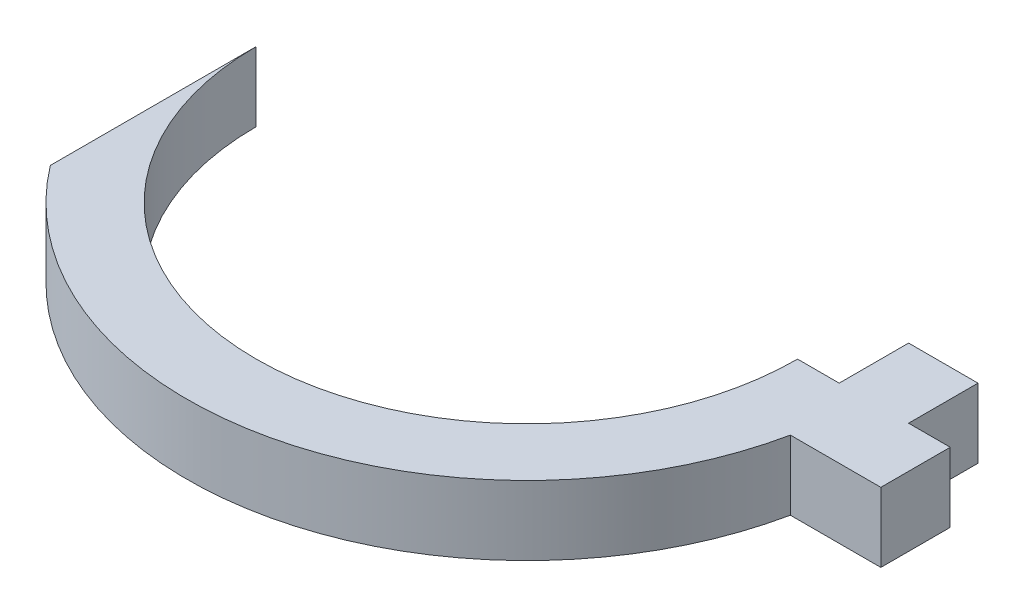
ISO-10303-21;
HEADER;
FILE_DESCRIPTION(('STEP AP214'),'2;1');
FILE_NAME('part.step','',(''),(''),'','','');
FILE_SCHEMA(('AUTOMOTIVE_DESIGN { 1 0 10303 214 1 1 1 1 }'));
ENDSEC;
DATA;
#1=APPLICATION_CONTEXT('core data for automotive mechanical design processes');
#2=APPLICATION_PROTOCOL_DEFINITION('international standard','automotive_design',2000,#1);
#3=PRODUCT_CONTEXT('',#1,'mechanical');
#4=PRODUCT('Part','Part','',(#3));
#5=PRODUCT_RELATED_PRODUCT_CATEGORY('part','',(#4));
#6=PRODUCT_DEFINITION_FORMATION('','',#4);
#7=PRODUCT_DEFINITION_CONTEXT('part definition',#1,'design');
#8=PRODUCT_DEFINITION('design','',#6,#7);
#9=PRODUCT_DEFINITION_SHAPE('','',#8);
#10=(LENGTH_UNIT() NAMED_UNIT(*) SI_UNIT(.MILLI.,.METRE.));
#11=(NAMED_UNIT(*) PLANE_ANGLE_UNIT() SI_UNIT($,.RADIAN.));
#12=(NAMED_UNIT(*) SI_UNIT($,.STERADIAN.) SOLID_ANGLE_UNIT());
#13=UNCERTAINTY_MEASURE_WITH_UNIT(LENGTH_MEASURE(1.E-05),#10,'distance_accuracy_value','');
#14=(GEOMETRIC_REPRESENTATION_CONTEXT(3) GLOBAL_UNCERTAINTY_ASSIGNED_CONTEXT((#13)) GLOBAL_UNIT_ASSIGNED_CONTEXT((#10,
#11,#12)) REPRESENTATION_CONTEXT('',''));
#15=CARTESIAN_POINT('',(0.,0.,0.));
#16=DIRECTION('',(0.,0.,1.));
#17=DIRECTION('',(1.,0.,0.));
#18=AXIS2_PLACEMENT_3D('',#15,#16,#17);
#19=CARTESIAN_POINT('',(0.,6.35,0.));
#20=DIRECTION('',(-1.,0.,0.));
#21=DIRECTION('',(0.,0.,1.));
#22=AXIS2_PLACEMENT_3D('',#19,#20,#21);
#23=PLANE('',#22);
#24=DIRECTION('',(0.,0.,-1.));
#25=VECTOR('',#24,1.);
#26=CARTESIAN_POINT('',(0.,0.,0.));
#27=LINE('',#26,#25);
#28=CARTESIAN_POINT('',(0.,0.,6.35));
#29=VERTEX_POINT('',#28);
#30=CARTESIAN_POINT('',(0.,0.,0.));
#31=VERTEX_POINT('',#30);
#32=EDGE_CURVE('E141',#29,#31,#27,.T.);
#33=ORIENTED_EDGE('',*,*,#32,.T.);
#34=DIRECTION('',(0.,-1.,0.));
#35=VECTOR('',#34,1.);
#36=CARTESIAN_POINT('',(0.,6.35,0.));
#37=LINE('',#36,#35);
#38=CARTESIAN_POINT('',(0.,6.35,0.));
#39=VERTEX_POINT('',#38);
#40=EDGE_CURVE('E11',#39,#31,#37,.T.);
#41=ORIENTED_EDGE('',*,*,#40,.F.);
#42=DIRECTION('',(0.,0.,-1.));
#43=VECTOR('',#42,1.);
#44=CARTESIAN_POINT('',(0.,6.35,0.));
#45=LINE('',#44,#43);
#46=CARTESIAN_POINT('',(0.,6.35,6.35));
#47=VERTEX_POINT('',#46);
#48=EDGE_CURVE('E159',#47,#39,#45,.T.);
#49=ORIENTED_EDGE('',*,*,#48,.F.);
#50=DIRECTION('',(0.,-1.,0.));
#51=VECTOR('',#50,1.);
#52=CARTESIAN_POINT('',(0.,6.35,6.35));
#53=LINE('',#52,#51);
#54=EDGE_CURVE('E137',#47,#29,#53,.T.);
#55=ORIENTED_EDGE('',*,*,#54,.T.);
#56=EDGE_LOOP('',(#33,#41,#49,#55));
#57=FACE_BOUND('',#56,.T.);
#58=ADVANCED_FACE('F33',(#57),#23,.F.);
#59=CARTESIAN_POINT('',(-6.34999999999999,6.35,0.));
#60=DIRECTION('',(0.,0.,1.));
#61=DIRECTION('',(1.,0.,0.));
#62=AXIS2_PLACEMENT_3D('',#59,#60,#61);
#63=PLANE('',#62);
#64=DIRECTION('',(-1.,0.,0.));
#65=VECTOR('',#64,1.);
#66=CARTESIAN_POINT('',(-6.34999999999999,0.,0.));
#67=LINE('',#66,#65);
#68=CARTESIAN_POINT('',(-6.34999999999999,0.,0.));
#69=VERTEX_POINT('',#68);
#70=EDGE_CURVE('E144',#31,#69,#67,.T.);
#71=ORIENTED_EDGE('',*,*,#70,.T.);
#72=DIRECTION('',(0.,-1.,0.));
#73=VECTOR('',#72,1.);
#74=CARTESIAN_POINT('',(-6.34999999999999,6.35,0.));
#75=LINE('',#74,#73);
#76=CARTESIAN_POINT('',(-6.34999999999999,6.35,0.));
#77=VERTEX_POINT('',#76);
#78=EDGE_CURVE('E41',#77,#69,#75,.T.);
#79=ORIENTED_EDGE('',*,*,#78,.F.);
#80=DIRECTION('',(-1.,0.,0.));
#81=VECTOR('',#80,1.);
#82=CARTESIAN_POINT('',(-6.34999999999999,6.35,0.));
#83=LINE('',#82,#81);
#84=EDGE_CURVE('E98',#39,#77,#83,.T.);
#85=ORIENTED_EDGE('',*,*,#84,.F.);
#86=ORIENTED_EDGE('',*,*,#40,.T.);
#87=EDGE_LOOP('',(#71,#79,#85,#86));
#88=FACE_BOUND('',#87,.T.);
#89=ADVANCED_FACE('F208',(#88),#63,.F.);
#90=CARTESIAN_POINT('',(-6.34999999999999,6.35,6.35));
#91=DIRECTION('',(1.,0.,0.));
#92=DIRECTION('',(0.,0.,-1.));
#93=AXIS2_PLACEMENT_3D('',#90,#91,#92);
#94=PLANE('',#93);
#95=DIRECTION('',(0.,0.,1.));
#96=VECTOR('',#95,1.);
#97=CARTESIAN_POINT('',(-6.34999999999999,0.,6.35));
#98=LINE('',#97,#96);
#99=CARTESIAN_POINT('',(-6.34999999999999,0.,6.35));
#100=VERTEX_POINT('',#99);
#101=EDGE_CURVE('E146',#69,#100,#98,.T.);
#102=ORIENTED_EDGE('',*,*,#101,.T.);
#103=DIRECTION('',(0.,-1.,0.));
#104=VECTOR('',#103,1.);
#105=CARTESIAN_POINT('',(-6.34999999999999,6.35,6.35));
#106=LINE('',#105,#104);
#107=CARTESIAN_POINT('',(-6.34999999999999,6.35,6.35));
#108=VERTEX_POINT('',#107);
#109=EDGE_CURVE('E172',#108,#100,#106,.T.);
#110=ORIENTED_EDGE('',*,*,#109,.F.);
#111=DIRECTION('',(0.,0.,1.));
#112=VECTOR('',#111,1.);
#113=CARTESIAN_POINT('',(-6.34999999999999,6.35,6.35));
#114=LINE('',#113,#112);
#115=EDGE_CURVE('E180',#77,#108,#114,.T.);
#116=ORIENTED_EDGE('',*,*,#115,.F.);
#117=ORIENTED_EDGE('',*,*,#78,.T.);
#118=EDGE_LOOP('',(#102,#110,#116,#117));
#119=FACE_BOUND('',#118,.T.);
#120=ADVANCED_FACE('F178',(#119),#94,.F.);
#121=CARTESIAN_POINT('',(-6.34999999999999,6.35,6.35));
#122=DIRECTION('',(0.,0.,1.));
#123=DIRECTION('',(1.,0.,0.));
#124=AXIS2_PLACEMENT_3D('',#121,#122,#123);
#125=PLANE('',#124);
#126=DIRECTION('',(-1.,0.,0.));
#127=VECTOR('',#126,1.);
#128=CARTESIAN_POINT('',(-6.34999999999999,0.,6.35));
#129=LINE('',#128,#127);
#130=CARTESIAN_POINT('',(-10.16,0.,6.35));
#131=VERTEX_POINT('',#130);
#132=EDGE_CURVE('E148',#100,#131,#129,.T.);
#133=ORIENTED_EDGE('',*,*,#132,.T.);
#134=DIRECTION('',(0.,-1.,0.));
#135=VECTOR('',#134,1.);
#136=CARTESIAN_POINT('',(-10.16,6.35,6.35));
#137=LINE('',#136,#135);
#138=CARTESIAN_POINT('',(-10.16,6.35,6.35));
#139=VERTEX_POINT('',#138);
#140=EDGE_CURVE('E169',#139,#131,#137,.T.);
#141=ORIENTED_EDGE('',*,*,#140,.F.);
#142=DIRECTION('',(-1.,0.,0.));
#143=VECTOR('',#142,1.);
#144=CARTESIAN_POINT('',(-6.34999999999999,6.35,6.35));
#145=LINE('',#144,#143);
#146=EDGE_CURVE('E198',#108,#139,#145,.T.);
#147=ORIENTED_EDGE('',*,*,#146,.F.);
#148=ORIENTED_EDGE('',*,*,#109,.T.);
#149=EDGE_LOOP('',(#133,#141,#147,#148));
#150=FACE_BOUND('',#149,.T.);
#151=ADVANCED_FACE('F189',(#150),#125,.F.);
#152=CARTESIAN_POINT('',(-34.925,6.35,6.35));
#153=DIRECTION('',(0.,-1.,0.));
#154=DIRECTION('',(0.,0.,-1.));
#155=AXIS2_PLACEMENT_3D('',#152,#153,#154);
#156=CYLINDRICAL_SURFACE('',#155,24.765);
#157=CARTESIAN_POINT('',(-34.925,0.,6.35));
#158=DIRECTION('',(0.,-1.,0.));
#159=DIRECTION('',(0.,0.,-1.));
#160=AXIS2_PLACEMENT_3D('',#157,#158,#159);
#161=CIRCLE('',#160,24.765);
#162=CARTESIAN_POINT('',(-59.69,0.,6.35000000000001));
#163=VERTEX_POINT('',#162);
#164=EDGE_CURVE('E150',#131,#163,#161,.T.);
#165=ORIENTED_EDGE('',*,*,#164,.T.);
#166=DIRECTION('',(0.,-1.,0.));
#167=VECTOR('',#166,1.);
#168=CARTESIAN_POINT('',(-59.69,6.35,6.35000000000001));
#169=LINE('',#168,#167);
#170=CARTESIAN_POINT('',(-59.69,6.35,6.35000000000001));
#171=VERTEX_POINT('',#170);
#172=EDGE_CURVE('E166',#171,#163,#169,.T.);
#173=ORIENTED_EDGE('',*,*,#172,.F.);
#174=CARTESIAN_POINT('',(-34.925,6.35,6.35));
#175=DIRECTION('',(0.,-1.,0.));
#176=DIRECTION('',(0.,0.,-1.));
#177=AXIS2_PLACEMENT_3D('',#174,#175,#176);
#178=CIRCLE('',#177,24.765);
#179=EDGE_CURVE('E195',#139,#171,#178,.T.);
#180=ORIENTED_EDGE('',*,*,#179,.F.);
#181=ORIENTED_EDGE('',*,*,#140,.T.);
#182=EDGE_LOOP('',(#165,#173,#180,#181));
#183=FACE_BOUND('',#182,.T.);
#184=ADVANCED_FACE('F193',(#183),#156,.F.);
#185=CARTESIAN_POINT('',(-59.69,6.35,6.35));
#186=DIRECTION('',(1.,0.,0.));
#187=DIRECTION('',(0.,0.,-1.));
#188=AXIS2_PLACEMENT_3D('',#185,#186,#187);
#189=PLANE('',#188);
#190=DIRECTION('',(0.,0.,1.));
#191=VECTOR('',#190,1.);
#192=CARTESIAN_POINT('',(-59.69,0.,6.35));
#193=LINE('',#192,#191);
#194=CARTESIAN_POINT('',(-59.69,0.,25.187144157223));
#195=VERTEX_POINT('',#194);
#196=EDGE_CURVE('E152',#163,#195,#193,.T.);
#197=ORIENTED_EDGE('',*,*,#196,.T.);
#198=DIRECTION('',(0.,-1.,0.));
#199=VECTOR('',#198,1.);
#200=CARTESIAN_POINT('',(-59.69,6.35,25.187144157223));
#201=LINE('',#200,#199);
#202=CARTESIAN_POINT('',(-59.69,6.35,25.187144157223));
#203=VERTEX_POINT('',#202);
#204=EDGE_CURVE('E163',#203,#195,#201,.T.);
#205=ORIENTED_EDGE('',*,*,#204,.F.);
#206=DIRECTION('',(0.,0.,1.));
#207=VECTOR('',#206,1.);
#208=CARTESIAN_POINT('',(-59.69,6.35,6.35));
#209=LINE('',#208,#207);
#210=EDGE_CURVE('E197',#171,#203,#209,.T.);
#211=ORIENTED_EDGE('',*,*,#210,.F.);
#212=ORIENTED_EDGE('',*,*,#172,.T.);
#213=EDGE_LOOP('',(#197,#205,#211,#212));
#214=FACE_BOUND('',#213,.T.);
#215=ADVANCED_FACE('F220',(#214),#189,.F.);
#216=CARTESIAN_POINT('',(-34.925,6.35,6.35));
#217=DIRECTION('',(0.,-1.,0.));
#218=DIRECTION('',(0.,0.,-1.));
#219=AXIS2_PLACEMENT_3D('',#216,#217,#218);
#220=CYLINDRICAL_SURFACE('',#219,31.115);
#221=CARTESIAN_POINT('',(-34.925,0.,6.35));
#222=DIRECTION('',(0.,1.,0.));
#223=DIRECTION('',(0.,0.,1.));
#224=AXIS2_PLACEMENT_3D('',#221,#222,#223);
#225=CIRCLE('',#224,31.115);
#226=CARTESIAN_POINT('',(-4.46485021376289,0.,12.7));
#227=VERTEX_POINT('',#226);
#228=EDGE_CURVE('E154',#195,#227,#225,.T.);
#229=ORIENTED_EDGE('',*,*,#228,.T.);
#230=DIRECTION('',(0.,-1.,0.));
#231=VECTOR('',#230,1.);
#232=CARTESIAN_POINT('',(-4.46485021376289,6.35,12.7));
#233=LINE('',#232,#231);
#234=CARTESIAN_POINT('',(-4.46485021376289,6.35,12.7));
#235=VERTEX_POINT('',#234);
#236=EDGE_CURVE('E132',#235,#227,#233,.T.);
#237=ORIENTED_EDGE('',*,*,#236,.F.);
#238=CARTESIAN_POINT('',(-34.925,6.35,6.35));
#239=DIRECTION('',(0.,1.,0.));
#240=DIRECTION('',(0.,0.,1.));
#241=AXIS2_PLACEMENT_3D('',#238,#239,#240);
#242=CIRCLE('',#241,31.115);
#243=EDGE_CURVE('E123',#203,#235,#242,.T.);
#244=ORIENTED_EDGE('',*,*,#243,.F.);
#245=ORIENTED_EDGE('',*,*,#204,.T.);
#246=EDGE_LOOP('',(#229,#237,#244,#245));
#247=FACE_BOUND('',#246,.T.);
#248=ADVANCED_FACE('F223',(#247),#220,.T.);
#249=CARTESIAN_POINT('',(3.81,6.35,12.7));
#250=DIRECTION('',(0.,0.,-1.));
#251=DIRECTION('',(-1.,0.,0.));
#252=AXIS2_PLACEMENT_3D('',#249,#250,#251);
#253=PLANE('',#252);
#254=DIRECTION('',(1.,0.,0.));
#255=VECTOR('',#254,1.);
#256=CARTESIAN_POINT('',(3.81,0.,12.7));
#257=LINE('',#256,#255);
#258=CARTESIAN_POINT('',(3.81,0.,12.7));
#259=VERTEX_POINT('',#258);
#260=EDGE_CURVE('E131',#227,#259,#257,.T.);
#261=ORIENTED_EDGE('',*,*,#260,.T.);
#262=DIRECTION('',(0.,-1.,0.));
#263=VECTOR('',#262,1.);
#264=CARTESIAN_POINT('',(3.81,6.35,12.7));
#265=LINE('',#264,#263);
#266=CARTESIAN_POINT('',(3.81,6.35,12.7));
#267=VERTEX_POINT('',#266);
#268=EDGE_CURVE('E128',#267,#259,#265,.T.);
#269=ORIENTED_EDGE('',*,*,#268,.F.);
#270=DIRECTION('',(1.,0.,0.));
#271=VECTOR('',#270,1.);
#272=CARTESIAN_POINT('',(3.81,6.35,12.7));
#273=LINE('',#272,#271);
#274=EDGE_CURVE('E117',#235,#267,#273,.T.);
#275=ORIENTED_EDGE('',*,*,#274,.F.);
#276=ORIENTED_EDGE('',*,*,#236,.T.);
#277=EDGE_LOOP('',(#261,#269,#275,#276));
#278=FACE_BOUND('',#277,.T.);
#279=ADVANCED_FACE('F129',(#278),#253,.F.);
#280=CARTESIAN_POINT('',(3.81,6.35,6.35));
#281=DIRECTION('',(-1.,0.,0.));
#282=DIRECTION('',(0.,0.,1.));
#283=AXIS2_PLACEMENT_3D('',#280,#281,#282);
#284=PLANE('',#283);
#285=DIRECTION('',(0.,0.,-1.));
#286=VECTOR('',#285,1.);
#287=CARTESIAN_POINT('',(3.81,0.,6.35));
#288=LINE('',#287,#286);
#289=CARTESIAN_POINT('',(3.81,0.,6.35));
#290=VERTEX_POINT('',#289);
#291=EDGE_CURVE('E84',#259,#290,#288,.T.);
#292=ORIENTED_EDGE('',*,*,#291,.T.);
#293=DIRECTION('',(0.,-1.,0.));
#294=VECTOR('',#293,1.);
#295=CARTESIAN_POINT('',(3.81,6.35,6.35));
#296=LINE('',#295,#294);
#297=CARTESIAN_POINT('',(3.81,6.35,6.35));
#298=VERTEX_POINT('',#297);
#299=EDGE_CURVE('E133',#298,#290,#296,.T.);
#300=ORIENTED_EDGE('',*,*,#299,.F.);
#301=DIRECTION('',(0.,0.,-1.));
#302=VECTOR('',#301,1.);
#303=CARTESIAN_POINT('',(3.81,6.35,6.35));
#304=LINE('',#303,#302);
#305=EDGE_CURVE('E121',#267,#298,#304,.T.);
#306=ORIENTED_EDGE('',*,*,#305,.F.);
#307=ORIENTED_EDGE('',*,*,#268,.T.);
#308=EDGE_LOOP('',(#292,#300,#306,#307));
#309=FACE_BOUND('',#308,.T.);
#310=ADVANCED_FACE('F135',(#309),#284,.F.);
#311=CARTESIAN_POINT('',(0.,6.35,6.35));
#312=DIRECTION('',(0.,0.,1.));
#313=DIRECTION('',(1.,0.,0.));
#314=AXIS2_PLACEMENT_3D('',#311,#312,#313);
#315=PLANE('',#314);
#316=DIRECTION('',(-1.,0.,0.));
#317=VECTOR('',#316,1.);
#318=CARTESIAN_POINT('',(0.,0.,6.35));
#319=LINE('',#318,#317);
#320=EDGE_CURVE('E90',#290,#29,#319,.T.);
#321=ORIENTED_EDGE('',*,*,#320,.T.);
#322=ORIENTED_EDGE('',*,*,#54,.F.);
#323=DIRECTION('',(-1.,0.,0.));
#324=VECTOR('',#323,1.);
#325=CARTESIAN_POINT('',(0.,6.35,6.35));
#326=LINE('',#325,#324);
#327=EDGE_CURVE('E49',#298,#47,#326,.T.);
#328=ORIENTED_EDGE('',*,*,#327,.F.);
#329=ORIENTED_EDGE('',*,*,#299,.T.);
#330=EDGE_LOOP('',(#321,#322,#328,#329));
#331=FACE_BOUND('',#330,.T.);
#332=ADVANCED_FACE('F232',(#331),#315,.F.);
#333=CARTESIAN_POINT('',(-34.925,6.35,6.35));
#334=DIRECTION('',(0.,1.,0.));
#335=DIRECTION('',(0.,0.,1.));
#336=AXIS2_PLACEMENT_3D('',#333,#334,#335);
#337=PLANE('',#336);
#338=ORIENTED_EDGE('',*,*,#48,.T.);
#339=ORIENTED_EDGE('',*,*,#84,.T.);
#340=ORIENTED_EDGE('',*,*,#115,.T.);
#341=ORIENTED_EDGE('',*,*,#146,.T.);
#342=ORIENTED_EDGE('',*,*,#179,.T.);
#343=ORIENTED_EDGE('',*,*,#210,.T.);
#344=ORIENTED_EDGE('',*,*,#243,.T.);
#345=ORIENTED_EDGE('',*,*,#274,.T.);
#346=ORIENTED_EDGE('',*,*,#305,.T.);
#347=ORIENTED_EDGE('',*,*,#327,.T.);
#348=EDGE_LOOP('',(#338,#339,#340,#341,#342,#343,#344,#345,#346,#347));
#349=FACE_BOUND('',#348,.T.);
#350=ADVANCED_FACE('F119',(#349),#337,.T.);
#351=CARTESIAN_POINT('',(-34.925,0.,6.35));
#352=DIRECTION('',(0.,1.,0.));
#353=DIRECTION('',(0.,0.,1.));
#354=AXIS2_PLACEMENT_3D('',#351,#352,#353);
#355=PLANE('',#354);
#356=ORIENTED_EDGE('',*,*,#32,.F.);
#357=ORIENTED_EDGE('',*,*,#320,.F.);
#358=ORIENTED_EDGE('',*,*,#291,.F.);
#359=ORIENTED_EDGE('',*,*,#260,.F.);
#360=ORIENTED_EDGE('',*,*,#228,.F.);
#361=ORIENTED_EDGE('',*,*,#196,.F.);
#362=ORIENTED_EDGE('',*,*,#164,.F.);
#363=ORIENTED_EDGE('',*,*,#132,.F.);
#364=ORIENTED_EDGE('',*,*,#101,.F.);
#365=ORIENTED_EDGE('',*,*,#70,.F.);
#366=EDGE_LOOP('',(#356,#357,#358,#359,#360,#361,#362,#363,#364,#365));
#367=FACE_BOUND('',#366,.T.);
#368=ADVANCED_FACE('F184',(#367),#355,.F.);
#369=CLOSED_SHELL('',(#58,#89,#120,#151,#184,#215,#248,#279,#310,#332,#350,#368));
#370=MANIFOLD_SOLID_BREP('B2',#369);
#371=ADVANCED_BREP_SHAPE_REPRESENTATION('',(#18,#370),#14);
#372=SHAPE_DEFINITION_REPRESENTATION(#9,#371);
ENDSEC;
END-ISO-10303-21;
